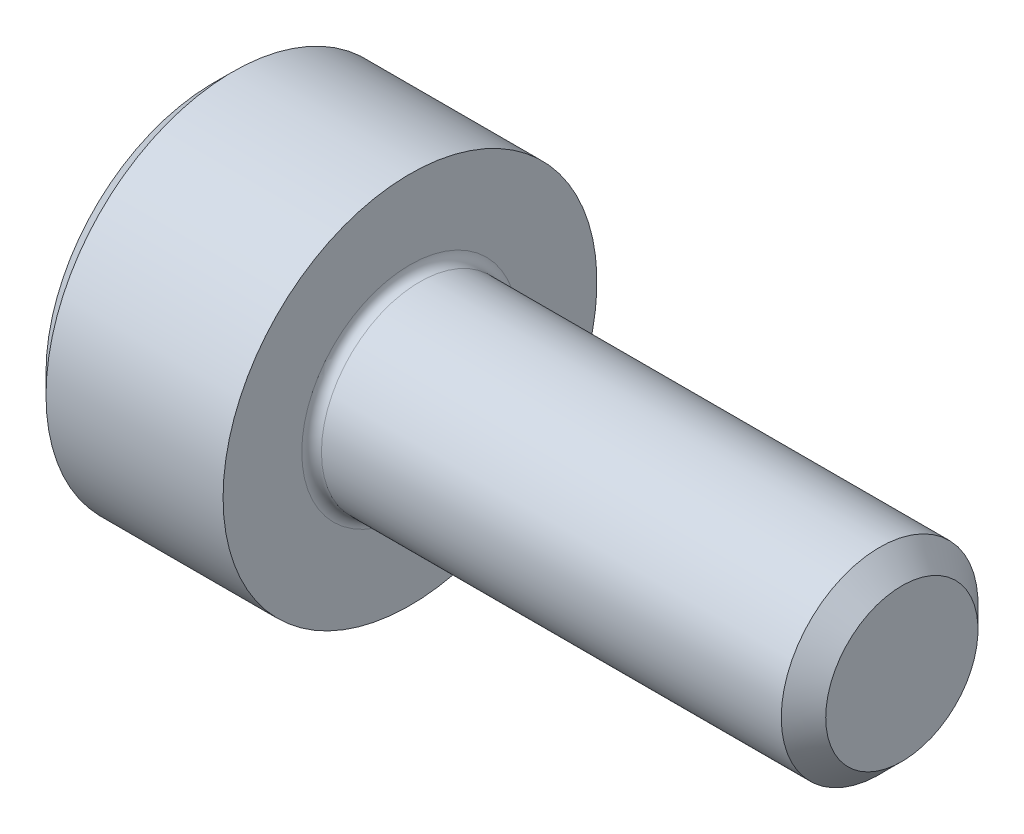
ISO-10303-21;
HEADER;
FILE_DESCRIPTION(('STEP AP214'),'2;1');
FILE_NAME('part.step','',(''),(''),'','','');
FILE_SCHEMA(('AUTOMOTIVE_DESIGN { 1 0 10303 214 1 1 1 1 }'));
ENDSEC;
DATA;
#1=APPLICATION_CONTEXT('core data for automotive mechanical design processes');
#2=APPLICATION_PROTOCOL_DEFINITION('international standard','automotive_design',2000,#1);
#3=PRODUCT_CONTEXT('',#1,'mechanical');
#4=PRODUCT('Part','Part','',(#3));
#5=PRODUCT_RELATED_PRODUCT_CATEGORY('part','',(#4));
#6=PRODUCT_DEFINITION_FORMATION('','',#4);
#7=PRODUCT_DEFINITION_CONTEXT('part definition',#1,'design');
#8=PRODUCT_DEFINITION('design','',#6,#7);
#9=PRODUCT_DEFINITION_SHAPE('','',#8);
#10=(LENGTH_UNIT() NAMED_UNIT(*) SI_UNIT(.MILLI.,.METRE.));
#11=(NAMED_UNIT(*) PLANE_ANGLE_UNIT() SI_UNIT($,.RADIAN.));
#12=(NAMED_UNIT(*) SI_UNIT($,.STERADIAN.) SOLID_ANGLE_UNIT());
#13=UNCERTAINTY_MEASURE_WITH_UNIT(LENGTH_MEASURE(1.E-05),#10,'distance_accuracy_value','');
#14=(GEOMETRIC_REPRESENTATION_CONTEXT(3) GLOBAL_UNCERTAINTY_ASSIGNED_CONTEXT((#13)) GLOBAL_UNIT_ASSIGNED_CONTEXT((#10,
#11,#12)) REPRESENTATION_CONTEXT('',''));
#15=CARTESIAN_POINT('',(0.,0.,0.));
#16=DIRECTION('',(0.,0.,1.));
#17=DIRECTION('',(1.,0.,0.));
#18=AXIS2_PLACEMENT_3D('',#15,#16,#17);
#19=CARTESIAN_POINT('',(0.,0.,0.));
#20=DIRECTION('',(-1.,0.,0.));
#21=DIRECTION('',(0.,0.,1.));
#22=AXIS2_PLACEMENT_3D('',#19,#20,#21);
#23=PLANE('',#22);
#24=DIRECTION('',(0.,-0.5,0.866025403784439));
#25=VECTOR('',#24,1.);
#26=CARTESIAN_POINT('',(0.,0.892006165897969,0.));
#27=LINE('',#26,#25);
#28=CARTESIAN_POINT('',(0.,0.892006165897969,0.));
#29=VERTEX_POINT('',#28);
#30=CARTESIAN_POINT('',(0.,0.446003082948983,0.772499999999996));
#31=VERTEX_POINT('',#30);
#32=EDGE_CURVE('E387',#29,#31,#27,.T.);
#33=ORIENTED_EDGE('',*,*,#32,.T.);
#34=DIRECTION('',(0.,1.,0.));
#35=VECTOR('',#34,1.);
#36=CARTESIAN_POINT('',(0.,-0.446003082948989,0.772499999999998));
#37=LINE('',#36,#35);
#38=CARTESIAN_POINT('',(0.,-0.446003082948989,0.772499999999998));
#39=VERTEX_POINT('',#38);
#40=EDGE_CURVE('E131',#39,#31,#37,.T.);
#41=ORIENTED_EDGE('',*,*,#40,.F.);
#42=DIRECTION('',(0.,-0.500000000000001,-0.866025403784438));
#43=VECTOR('',#42,1.);
#44=CARTESIAN_POINT('',(0.,-0.446003082948989,0.772499999999998));
#45=LINE('',#44,#43);
#46=CARTESIAN_POINT('',(0.,-0.892006165897976,0.));
#47=VERTEX_POINT('',#46);
#48=EDGE_CURVE('E390',#39,#47,#45,.T.);
#49=ORIENTED_EDGE('',*,*,#48,.T.);
#50=DIRECTION('',(0.,0.5,-0.866025403784439));
#51=VECTOR('',#50,1.);
#52=CARTESIAN_POINT('',(0.,-0.892006165897976,0.));
#53=LINE('',#52,#51);
#54=CARTESIAN_POINT('',(0.,-0.44600308294899,-0.772500000000002));
#55=VERTEX_POINT('',#54);
#56=EDGE_CURVE('E393',#47,#55,#53,.T.);
#57=ORIENTED_EDGE('',*,*,#56,.T.);
#58=DIRECTION('',(0.,-1.,0.));
#59=VECTOR('',#58,1.);
#60=CARTESIAN_POINT('',(0.,0.446003082948982,-0.772500000000003));
#61=LINE('',#60,#59);
#62=CARTESIAN_POINT('',(0.,0.446003082948982,-0.772500000000003));
#63=VERTEX_POINT('',#62);
#64=EDGE_CURVE('E396',#63,#55,#61,.T.);
#65=ORIENTED_EDGE('',*,*,#64,.F.);
#66=DIRECTION('',(0.,-0.500000000000001,-0.866025403784438));
#67=VECTOR('',#66,1.);
#68=CARTESIAN_POINT('',(0.,0.892006165897969,0.));
#69=LINE('',#68,#67);
#70=EDGE_CURVE('E126',#29,#63,#69,.T.);
#71=ORIENTED_EDGE('',*,*,#70,.F.);
#72=EDGE_LOOP('',(#33,#41,#49,#57,#65,#71));
#73=FACE_BOUND('',#72,.T.);
#74=CARTESIAN_POINT('',(0.,0.,0.));
#75=DIRECTION('',(-1.,0.,0.));
#76=DIRECTION('',(0.,0.,1.));
#77=AXIS2_PLACEMENT_3D('',#74,#75,#76);
#78=CIRCLE('',#77,1.7);
#79=CARTESIAN_POINT('',(0.,0.,1.7));
#80=VERTEX_POINT('',#79);
#81=EDGE_CURVE('E142',#80,#80,#78,.T.);
#82=ORIENTED_EDGE('',*,*,#81,.T.);
#83=EDGE_LOOP('',(#82));
#84=FACE_BOUND('',#83,.T.);
#85=ADVANCED_FACE('F35',(#73,#84),#23,.T.);
#86=CARTESIAN_POINT('',(7.,0.774,0.));
#87=DIRECTION('',(1.,0.,0.));
#88=DIRECTION('',(0.,0.,-1.));
#89=AXIS2_PLACEMENT_3D('',#86,#87,#88);
#90=PLANE('',#89);
#91=CARTESIAN_POINT('',(7.,0.,0.));
#92=DIRECTION('',(-1.,0.,0.));
#93=DIRECTION('',(0.,0.,1.));
#94=AXIS2_PLACEMENT_3D('',#91,#92,#93);
#95=CIRCLE('',#94,0.774);
#96=CARTESIAN_POINT('',(7.,0.,0.774));
#97=VERTEX_POINT('',#96);
#98=EDGE_CURVE('E155',#97,#97,#95,.T.);
#99=ORIENTED_EDGE('',*,*,#98,.F.);
#100=EDGE_LOOP('',(#99));
#101=FACE_BOUND('',#100,.T.);
#102=ADVANCED_FACE('F176',(#101),#90,.T.);
#103=CARTESIAN_POINT('',(7.,0.,0.));
#104=DIRECTION('',(-1.,0.,0.));
#105=DIRECTION('',(0.,0.,1.));
#106=AXIS2_PLACEMENT_3D('',#103,#104,#105);
#107=CONICAL_SURFACE('',#106,0.774,0.785398163397446);
#108=CARTESIAN_POINT('',(6.774,0.,0.));
#109=DIRECTION('',(-1.,0.,0.));
#110=DIRECTION('',(0.,0.,1.));
#111=AXIS2_PLACEMENT_3D('',#108,#109,#110);
#112=CIRCLE('',#111,0.999999999999996);
#113=CARTESIAN_POINT('',(6.774,0.,0.999999999999996));
#114=VERTEX_POINT('',#113);
#115=EDGE_CURVE('E152',#114,#114,#112,.T.);
#116=ORIENTED_EDGE('',*,*,#115,.F.);
#117=EDGE_LOOP('',(#116));
#118=FACE_BOUND('',#117,.T.);
#119=ORIENTED_EDGE('',*,*,#98,.T.);
#120=EDGE_LOOP('',(#119));
#121=FACE_BOUND('',#120,.T.);
#122=ADVANCED_FACE('F182',(#118,#121),#107,.T.);
#123=CARTESIAN_POINT('',(-31.75,0.,0.));
#124=DIRECTION('',(-1.,0.,0.));
#125=DIRECTION('',(0.,0.,1.));
#126=AXIS2_PLACEMENT_3D('',#123,#124,#125);
#127=CYLINDRICAL_SURFACE('',#126,0.999999999999998);
#128=CARTESIAN_POINT('',(2.1,0.,0.));
#129=DIRECTION('',(1.,0.,0.));
#130=DIRECTION('',(0.,0.,-1.));
#131=AXIS2_PLACEMENT_3D('',#128,#129,#130);
#132=CIRCLE('',#131,0.999999999999998);
#133=CARTESIAN_POINT('',(2.1,0.,-0.999999999999998));
#134=VERTEX_POINT('',#133);
#135=EDGE_CURVE('E11',#134,#134,#132,.T.);
#136=ORIENTED_EDGE('',*,*,#135,.T.);
#137=EDGE_LOOP('',(#136));
#138=FACE_BOUND('',#137,.T.);
#139=ORIENTED_EDGE('',*,*,#115,.T.);
#140=EDGE_LOOP('',(#139));
#141=FACE_BOUND('',#140,.T.);
#142=ADVANCED_FACE('F193',(#138,#141),#127,.T.);
#143=CARTESIAN_POINT('',(2.,1.9,0.));
#144=DIRECTION('',(1.,0.,0.));
#145=DIRECTION('',(0.,0.,-1.));
#146=AXIS2_PLACEMENT_3D('',#143,#144,#145);
#147=PLANE('',#146);
#148=CARTESIAN_POINT('',(2.,0.,0.));
#149=DIRECTION('',(1.,0.,0.));
#150=DIRECTION('',(0.,0.,-1.));
#151=AXIS2_PLACEMENT_3D('',#148,#149,#150);
#152=CIRCLE('',#151,1.1);
#153=CARTESIAN_POINT('',(2.,0.,-1.1));
#154=VERTEX_POINT('',#153);
#155=EDGE_CURVE('E43',#154,#154,#152,.F.);
#156=ORIENTED_EDGE('',*,*,#155,.T.);
#157=EDGE_LOOP('',(#156));
#158=FACE_BOUND('',#157,.T.);
#159=CARTESIAN_POINT('',(2.,0.,0.));
#160=DIRECTION('',(-1.,0.,0.));
#161=DIRECTION('',(0.,0.,1.));
#162=AXIS2_PLACEMENT_3D('',#159,#160,#161);
#163=CIRCLE('',#162,1.9);
#164=CARTESIAN_POINT('',(2.,0.,1.9));
#165=VERTEX_POINT('',#164);
#166=EDGE_CURVE('E149',#165,#165,#163,.T.);
#167=ORIENTED_EDGE('',*,*,#166,.F.);
#168=EDGE_LOOP('',(#167));
#169=FACE_BOUND('',#168,.T.);
#170=ADVANCED_FACE('F160',(#158,#169),#147,.T.);
#171=CARTESIAN_POINT('',(-31.75,0.,0.));
#172=DIRECTION('',(-1.,0.,0.));
#173=DIRECTION('',(0.,0.,1.));
#174=AXIS2_PLACEMENT_3D('',#171,#172,#173);
#175=CYLINDRICAL_SURFACE('',#174,1.9);
#176=ORIENTED_EDGE('',*,*,#166,.T.);
#177=EDGE_LOOP('',(#176));
#178=FACE_BOUND('',#177,.T.);
#179=CARTESIAN_POINT('',(0.199999999999999,0.,0.));
#180=DIRECTION('',(-1.,0.,0.));
#181=DIRECTION('',(0.,0.,1.));
#182=AXIS2_PLACEMENT_3D('',#179,#180,#181);
#183=CIRCLE('',#182,1.9);
#184=CARTESIAN_POINT('',(0.199999999999999,0.,1.9));
#185=VERTEX_POINT('',#184);
#186=EDGE_CURVE('E146',#185,#185,#183,.T.);
#187=ORIENTED_EDGE('',*,*,#186,.F.);
#188=EDGE_LOOP('',(#187));
#189=FACE_BOUND('',#188,.T.);
#190=ADVANCED_FACE('F171',(#178,#189),#175,.T.);
#191=CARTESIAN_POINT('',(0.,0.,0.));
#192=DIRECTION('',(1.,0.,0.));
#193=DIRECTION('',(0.,0.,-1.));
#194=AXIS2_PLACEMENT_3D('',#191,#192,#193);
#195=CONICAL_SURFACE('',#194,1.7,0.785398163397453);
#196=ORIENTED_EDGE('',*,*,#186,.T.);
#197=EDGE_LOOP('',(#196));
#198=FACE_BOUND('',#197,.T.);
#199=ORIENTED_EDGE('',*,*,#81,.F.);
#200=EDGE_LOOP('',(#199));
#201=FACE_BOUND('',#200,.T.);
#202=ADVANCED_FACE('F164',(#198,#201),#195,.T.);
#203=CARTESIAN_POINT('',(2.1,0.,0.));
#204=DIRECTION('',(1.,0.,0.));
#205=DIRECTION('',(0.,0.,-1.));
#206=AXIS2_PLACEMENT_3D('',#203,#204,#205);
#207=TOROIDAL_SURFACE('',#206,1.1,0.1);
#208=ORIENTED_EDGE('',*,*,#135,.F.);
#209=EDGE_LOOP('',(#208));
#210=FACE_BOUND('',#209,.T.);
#211=ORIENTED_EDGE('',*,*,#155,.F.);
#212=EDGE_LOOP('',(#211));
#213=FACE_BOUND('',#212,.T.);
#214=ADVANCED_FACE('F37',(#210,#213),#207,.F.);
#215=CARTESIAN_POINT('',(1.,0.892006165897969,0.));
#216=DIRECTION('',(0.,-0.866025403784439,-0.5));
#217=DIRECTION('',(0.,0.5,-0.866025403784439));
#218=AXIS2_PLACEMENT_3D('',#215,#216,#217);
#219=PLANE('',#218);
#220=ORIENTED_EDGE('',*,*,#32,.F.);
#221=DIRECTION('',(-1.,0.,0.));
#222=VECTOR('',#221,1.);
#223=CARTESIAN_POINT('',(1.,0.892006165897969,0.));
#224=LINE('',#223,#222);
#225=CARTESIAN_POINT('',(1.,0.892006165897969,0.));
#226=VERTEX_POINT('',#225);
#227=EDGE_CURVE('E377',#226,#29,#224,.T.);
#228=ORIENTED_EDGE('',*,*,#227,.F.);
#229=DIRECTION('',(0.,-0.5,0.866025403784439));
#230=VECTOR('',#229,1.);
#231=CARTESIAN_POINT('',(1.,0.892006165897969,0.));
#232=LINE('',#231,#230);
#233=CARTESIAN_POINT('',(1.,0.669004624423475,0.386249999999998));
#234=VERTEX_POINT('',#233);
#235=EDGE_CURVE('E118',#226,#234,#232,.T.);
#236=ORIENTED_EDGE('',*,*,#235,.T.);
#237=CARTESIAN_POINT('',(1.,0.446003082948983,0.772499999999996));
#238=VERTEX_POINT('',#237);
#239=EDGE_CURVE('E109',#234,#238,#232,.T.);
#240=ORIENTED_EDGE('',*,*,#239,.T.);
#241=DIRECTION('',(-1.,0.,0.));
#242=VECTOR('',#241,1.);
#243=CARTESIAN_POINT('',(1.,0.446003082948983,0.772499999999996));
#244=LINE('',#243,#242);
#245=EDGE_CURVE('E123',#238,#31,#244,.T.);
#246=ORIENTED_EDGE('',*,*,#245,.T.);
#247=EDGE_LOOP('',(#220,#228,#236,#240,#246));
#248=FACE_BOUND('',#247,.T.);
#249=ADVANCED_FACE('F122',(#248),#219,.T.);
#250=CARTESIAN_POINT('',(1.,-0.446003082948989,0.772499999999998));
#251=DIRECTION('',(0.,0.,1.));
#252=DIRECTION('',(0.,-1.,0.));
#253=AXIS2_PLACEMENT_3D('',#250,#251,#252);
#254=PLANE('',#253);
#255=ORIENTED_EDGE('',*,*,#40,.T.);
#256=ORIENTED_EDGE('',*,*,#245,.F.);
#257=DIRECTION('',(0.,1.,0.));
#258=VECTOR('',#257,1.);
#259=CARTESIAN_POINT('',(1.,-0.446003082948989,0.772499999999998));
#260=LINE('',#259,#258);
#261=CARTESIAN_POINT('',(1.,0.,0.772499999999997));
#262=VERTEX_POINT('',#261);
#263=EDGE_CURVE('E106',#262,#238,#260,.T.);
#264=ORIENTED_EDGE('',*,*,#263,.F.);
#265=CARTESIAN_POINT('',(1.,-0.446003082948989,0.772499999999998));
#266=VERTEX_POINT('',#265);
#267=EDGE_CURVE('E117',#266,#262,#260,.T.);
#268=ORIENTED_EDGE('',*,*,#267,.F.);
#269=DIRECTION('',(-1.,0.,0.));
#270=VECTOR('',#269,1.);
#271=CARTESIAN_POINT('',(1.,-0.446003082948989,0.772499999999998));
#272=LINE('',#271,#270);
#273=EDGE_CURVE('E133',#266,#39,#272,.T.);
#274=ORIENTED_EDGE('',*,*,#273,.T.);
#275=EDGE_LOOP('',(#255,#256,#264,#268,#274));
#276=FACE_BOUND('',#275,.T.);
#277=ADVANCED_FACE('F128',(#276),#254,.F.);
#278=CARTESIAN_POINT('',(1.,-0.446003082948989,0.772499999999998));
#279=DIRECTION('',(0.,0.866025403784438,-0.500000000000001));
#280=DIRECTION('',(0.,0.500000000000001,0.866025403784438));
#281=AXIS2_PLACEMENT_3D('',#278,#279,#280);
#282=PLANE('',#281);
#283=ORIENTED_EDGE('',*,*,#48,.F.);
#284=ORIENTED_EDGE('',*,*,#273,.F.);
#285=DIRECTION('',(0.,-0.500000000000001,-0.866025403784438));
#286=VECTOR('',#285,1.);
#287=CARTESIAN_POINT('',(1.,-0.446003082948989,0.772499999999998));
#288=LINE('',#287,#286);
#289=CARTESIAN_POINT('',(1.,-0.66900462442348,0.386250000000002));
#290=VERTEX_POINT('',#289);
#291=EDGE_CURVE('E416',#266,#290,#288,.T.);
#292=ORIENTED_EDGE('',*,*,#291,.T.);
#293=CARTESIAN_POINT('',(1.,-0.892006165897976,0.));
#294=VERTEX_POINT('',#293);
#295=EDGE_CURVE('E405',#290,#294,#288,.T.);
#296=ORIENTED_EDGE('',*,*,#295,.T.);
#297=DIRECTION('',(-1.,0.,0.));
#298=VECTOR('',#297,1.);
#299=CARTESIAN_POINT('',(1.,-0.892006165897976,0.));
#300=LINE('',#299,#298);
#301=EDGE_CURVE('E138',#294,#47,#300,.T.);
#302=ORIENTED_EDGE('',*,*,#301,.T.);
#303=EDGE_LOOP('',(#283,#284,#292,#296,#302));
#304=FACE_BOUND('',#303,.T.);
#305=ADVANCED_FACE('F268',(#304),#282,.T.);
#306=CARTESIAN_POINT('',(1.,-0.892006165897976,0.));
#307=DIRECTION('',(0.,0.866025403784439,0.5));
#308=DIRECTION('',(0.,-0.5,0.866025403784439));
#309=AXIS2_PLACEMENT_3D('',#306,#307,#308);
#310=PLANE('',#309);
#311=ORIENTED_EDGE('',*,*,#56,.F.);
#312=ORIENTED_EDGE('',*,*,#301,.F.);
#313=DIRECTION('',(0.,0.5,-0.866025403784439));
#314=VECTOR('',#313,1.);
#315=CARTESIAN_POINT('',(1.,-0.892006165897976,0.));
#316=LINE('',#315,#314);
#317=CARTESIAN_POINT('',(1.,-0.669004624423483,-0.386250000000002));
#318=VERTEX_POINT('',#317);
#319=EDGE_CURVE('E383',#294,#318,#316,.T.);
#320=ORIENTED_EDGE('',*,*,#319,.T.);
#321=CARTESIAN_POINT('',(1.,-0.44600308294899,-0.772500000000002));
#322=VERTEX_POINT('',#321);
#323=EDGE_CURVE('E415',#318,#322,#316,.T.);
#324=ORIENTED_EDGE('',*,*,#323,.T.);
#325=DIRECTION('',(-1.,0.,0.));
#326=VECTOR('',#325,1.);
#327=CARTESIAN_POINT('',(1.,-0.44600308294899,-0.772500000000002));
#328=LINE('',#327,#326);
#329=EDGE_CURVE('E376',#322,#55,#328,.T.);
#330=ORIENTED_EDGE('',*,*,#329,.T.);
#331=EDGE_LOOP('',(#311,#312,#320,#324,#330));
#332=FACE_BOUND('',#331,.T.);
#333=ADVANCED_FACE('F276',(#332),#310,.T.);
#334=CARTESIAN_POINT('',(1.,0.446003082948982,-0.772500000000003));
#335=DIRECTION('',(0.,0.,-1.));
#336=DIRECTION('',(0.,1.,0.));
#337=AXIS2_PLACEMENT_3D('',#334,#335,#336);
#338=PLANE('',#337);
#339=ORIENTED_EDGE('',*,*,#64,.T.);
#340=ORIENTED_EDGE('',*,*,#329,.F.);
#341=DIRECTION('',(0.,-1.,0.));
#342=VECTOR('',#341,1.);
#343=CARTESIAN_POINT('',(1.,0.446003082948982,-0.772500000000003));
#344=LINE('',#343,#342);
#345=CARTESIAN_POINT('',(1.,0.,-0.7725));
#346=VERTEX_POINT('',#345);
#347=EDGE_CURVE('E380',#346,#322,#344,.T.);
#348=ORIENTED_EDGE('',*,*,#347,.F.);
#349=CARTESIAN_POINT('',(1.,0.446003082948982,-0.772500000000003));
#350=VERTEX_POINT('',#349);
#351=EDGE_CURVE('E50',#350,#346,#344,.T.);
#352=ORIENTED_EDGE('',*,*,#351,.F.);
#353=DIRECTION('',(-1.,0.,0.));
#354=VECTOR('',#353,1.);
#355=CARTESIAN_POINT('',(1.,0.446003082948982,-0.772500000000003));
#356=LINE('',#355,#354);
#357=EDGE_CURVE('E373',#350,#63,#356,.T.);
#358=ORIENTED_EDGE('',*,*,#357,.T.);
#359=EDGE_LOOP('',(#339,#340,#348,#352,#358));
#360=FACE_BOUND('',#359,.T.);
#361=ADVANCED_FACE('F285',(#360),#338,.F.);
#362=CARTESIAN_POINT('',(1.,0.892006165897969,0.));
#363=DIRECTION('',(0.,0.866025403784438,-0.500000000000001));
#364=DIRECTION('',(0.,0.500000000000001,0.866025403784438));
#365=AXIS2_PLACEMENT_3D('',#362,#363,#364);
#366=PLANE('',#365);
#367=ORIENTED_EDGE('',*,*,#70,.T.);
#368=ORIENTED_EDGE('',*,*,#357,.F.);
#369=DIRECTION('',(0.,-0.500000000000001,-0.866025403784438));
#370=VECTOR('',#369,1.);
#371=CARTESIAN_POINT('',(1.,0.892006165897969,0.));
#372=LINE('',#371,#370);
#373=CARTESIAN_POINT('',(1.,0.669004624423477,-0.38625));
#374=VERTEX_POINT('',#373);
#375=EDGE_CURVE('E363',#374,#350,#372,.T.);
#376=ORIENTED_EDGE('',*,*,#375,.F.);
#377=EDGE_CURVE('E369',#226,#374,#372,.T.);
#378=ORIENTED_EDGE('',*,*,#377,.F.);
#379=ORIENTED_EDGE('',*,*,#227,.T.);
#380=EDGE_LOOP('',(#367,#368,#376,#378,#379));
#381=FACE_BOUND('',#380,.T.);
#382=ADVANCED_FACE('F294',(#381),#366,.F.);
#383=CARTESIAN_POINT('',(1.,0.892006165897969,0.));
#384=DIRECTION('',(1.,0.,0.));
#385=DIRECTION('',(0.,0.,-1.));
#386=AXIS2_PLACEMENT_3D('',#383,#384,#385);
#387=PLANE('',#386);
#388=ORIENTED_EDGE('',*,*,#347,.T.);
#389=ORIENTED_EDGE('',*,*,#323,.F.);
#390=CARTESIAN_POINT('',(1.,0.,0.));
#391=DIRECTION('',(-1.,0.,0.));
#392=DIRECTION('',(0.,0.,1.));
#393=AXIS2_PLACEMENT_3D('',#390,#391,#392);
#394=CIRCLE('',#393,0.7725);
#395=EDGE_CURVE('E411',#346,#318,#394,.T.);
#396=ORIENTED_EDGE('',*,*,#395,.F.);
#397=EDGE_LOOP('',(#388,#389,#396));
#398=FACE_BOUND('',#397,.T.);
#399=ADVANCED_FACE('F303',(#398),#387,.F.);
#400=ORIENTED_EDGE('',*,*,#319,.F.);
#401=ORIENTED_EDGE('',*,*,#295,.F.);
#402=EDGE_CURVE('E136',#318,#290,#394,.T.);
#403=ORIENTED_EDGE('',*,*,#402,.F.);
#404=EDGE_LOOP('',(#400,#401,#403));
#405=FACE_BOUND('',#404,.T.);
#406=ADVANCED_FACE('F312',(#405),#387,.F.);
#407=ORIENTED_EDGE('',*,*,#291,.F.);
#408=ORIENTED_EDGE('',*,*,#267,.T.);
#409=EDGE_CURVE('E132',#290,#262,#394,.T.);
#410=ORIENTED_EDGE('',*,*,#409,.F.);
#411=EDGE_LOOP('',(#407,#408,#410));
#412=FACE_BOUND('',#411,.T.);
#413=ADVANCED_FACE('F321',(#412),#387,.F.);
#414=ORIENTED_EDGE('',*,*,#263,.T.);
#415=ORIENTED_EDGE('',*,*,#239,.F.);
#416=EDGE_CURVE('E112',#262,#234,#394,.T.);
#417=ORIENTED_EDGE('',*,*,#416,.F.);
#418=EDGE_LOOP('',(#414,#415,#417));
#419=FACE_BOUND('',#418,.T.);
#420=ADVANCED_FACE('F108',(#419),#387,.F.);
#421=ORIENTED_EDGE('',*,*,#235,.F.);
#422=ORIENTED_EDGE('',*,*,#377,.T.);
#423=EDGE_CURVE('E143',#234,#374,#394,.T.);
#424=ORIENTED_EDGE('',*,*,#423,.F.);
#425=EDGE_LOOP('',(#421,#422,#424));
#426=FACE_BOUND('',#425,.T.);
#427=ADVANCED_FACE('F336',(#426),#387,.F.);
#428=ORIENTED_EDGE('',*,*,#375,.T.);
#429=ORIENTED_EDGE('',*,*,#351,.T.);
#430=EDGE_CURVE('E366',#374,#346,#394,.T.);
#431=ORIENTED_EDGE('',*,*,#430,.F.);
#432=EDGE_LOOP('',(#428,#429,#431));
#433=FACE_BOUND('',#432,.T.);
#434=ADVANCED_FACE('F251',(#433),#387,.F.);
#435=CARTESIAN_POINT('',(1.,0.,0.));
#436=DIRECTION('',(-1.,0.,0.));
#437=DIRECTION('',(0.,0.,1.));
#438=AXIS2_PLACEMENT_3D('',#435,#436,#437);
#439=CONICAL_SURFACE('',#438,0.7725,1.04719755119659);
#440=CARTESIAN_POINT('',(1.446003082949,0.,0.));
#441=VERTEX_POINT('',#440);
#442=VERTEX_LOOP('',#441);
#443=FACE_BOUND('',#442,.T.);
#444=ORIENTED_EDGE('',*,*,#416,.T.);
#445=ORIENTED_EDGE('',*,*,#423,.T.);
#446=ORIENTED_EDGE('',*,*,#430,.T.);
#447=ORIENTED_EDGE('',*,*,#395,.T.);
#448=ORIENTED_EDGE('',*,*,#402,.T.);
#449=ORIENTED_EDGE('',*,*,#409,.T.);
#450=EDGE_LOOP('',(#444,#445,#446,#447,#448,#449));
#451=FACE_BOUND('',#450,.T.);
#452=ADVANCED_FACE('F186',(#443,#451),#439,.F.);
#453=CLOSED_SHELL('',(#85,#102,#122,#142,#170,#190,#202,#214,#249,#277,#305,#333,#361,#382,#399,
#406,#413,#420,#427,#434,#452));
#454=MANIFOLD_SOLID_BREP('B2',#453);
#455=ADVANCED_BREP_SHAPE_REPRESENTATION('',(#18,#454),#14);
#456=SHAPE_DEFINITION_REPRESENTATION(#9,#455);
ENDSEC;
END-ISO-10303-21;
